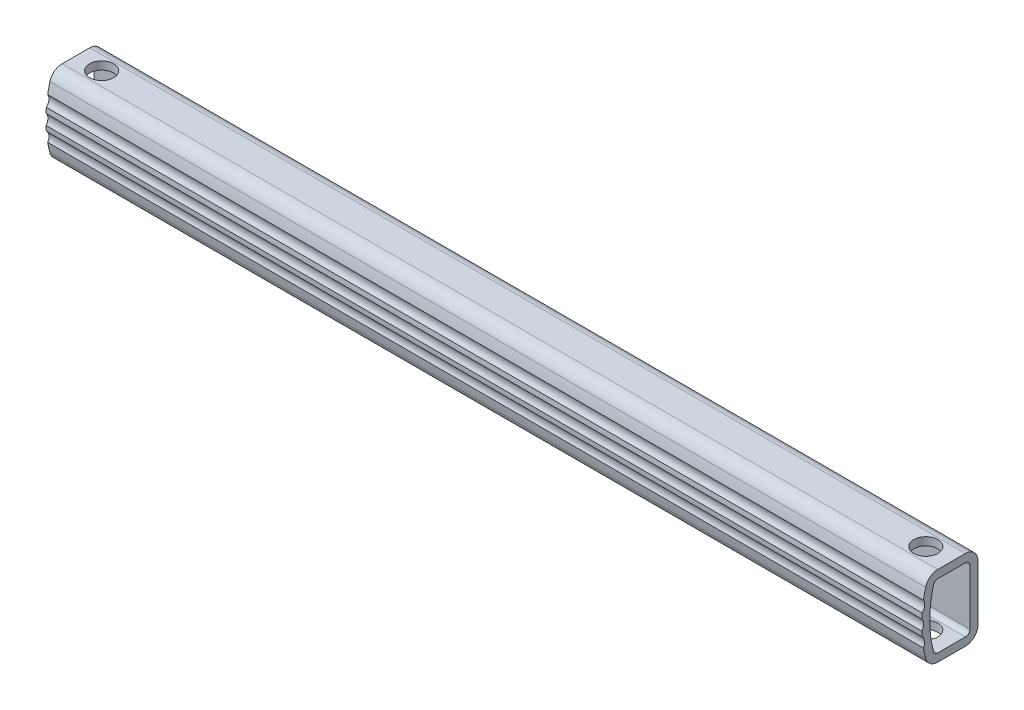
ISO-10303-21;
HEADER;
FILE_DESCRIPTION(('STEP AP214'),'2;1');
FILE_NAME('part.step','',(''),(''),'','','');
FILE_SCHEMA(('AUTOMOTIVE_DESIGN { 1 0 10303 214 1 1 1 1 }'));
ENDSEC;
DATA;
#1=APPLICATION_CONTEXT('core data for automotive mechanical design processes');
#2=APPLICATION_PROTOCOL_DEFINITION('international standard','automotive_design',2000,#1);
#3=PRODUCT_CONTEXT('',#1,'mechanical');
#4=PRODUCT('Part','Part','',(#3));
#5=PRODUCT_RELATED_PRODUCT_CATEGORY('part','',(#4));
#6=PRODUCT_DEFINITION_FORMATION('','',#4);
#7=PRODUCT_DEFINITION_CONTEXT('part definition',#1,'design');
#8=PRODUCT_DEFINITION('design','',#6,#7);
#9=PRODUCT_DEFINITION_SHAPE('','',#8);
#10=(LENGTH_UNIT() NAMED_UNIT(*) SI_UNIT(.MILLI.,.METRE.));
#11=(NAMED_UNIT(*) PLANE_ANGLE_UNIT() SI_UNIT($,.RADIAN.));
#12=(NAMED_UNIT(*) SI_UNIT($,.STERADIAN.) SOLID_ANGLE_UNIT());
#13=UNCERTAINTY_MEASURE_WITH_UNIT(LENGTH_MEASURE(1.E-05),#10,'distance_accuracy_value','');
#14=(GEOMETRIC_REPRESENTATION_CONTEXT(3) GLOBAL_UNCERTAINTY_ASSIGNED_CONTEXT((#13)) GLOBAL_UNIT_ASSIGNED_CONTEXT((#10,
#11,#12)) REPRESENTATION_CONTEXT('',''));
#15=CARTESIAN_POINT('',(0.,0.,0.));
#16=DIRECTION('',(0.,0.,1.));
#17=DIRECTION('',(1.,0.,0.));
#18=AXIS2_PLACEMENT_3D('',#15,#16,#17);
#19=CARTESIAN_POINT('',(54.5,0.,-11.270134066358));
#20=DIRECTION('',(-1.,0.,0.));
#21=DIRECTION('',(0.,0.,1.));
#22=AXIS2_PLACEMENT_3D('',#19,#20,#21);
#23=PLANE('',#22);
#24=CARTESIAN_POINT('',(54.5,0.,-11.270134066358));
#25=DIRECTION('',(1.,0.,0.));
#26=DIRECTION('',(0.,0.,1.));
#27=AXIS2_PLACEMENT_3D('',#24,#25,#26);
#28=CIRCLE('',#27,15.);
#29=CARTESIAN_POINT('',(54.5,3.83260030517907,3.23197525955527));
#30=VERTEX_POINT('',#29);
#31=CARTESIAN_POINT('',(54.5,2.5705835723426,3.50796121339987));
#32=VERTEX_POINT('',#31);
#33=EDGE_CURVE('E249',#30,#32,#28,.T.);
#34=ORIENTED_EDGE('',*,*,#33,.T.);
#35=CARTESIAN_POINT('',(54.5,2.02902279715001,4.34862281402928));
#36=DIRECTION('',(-1.,0.,0.));
#37=DIRECTION('',(0.,0.,-1.));
#38=AXIS2_PLACEMENT_3D('',#35,#36,#37);
#39=CIRCLE('',#38,1.);
#40=CARTESIAN_POINT('',(54.5,1.29064323211042,3.67423745095269));
#41=VERTEX_POINT('',#40);
#42=EDGE_CURVE('E252',#32,#41,#39,.T.);
#43=ORIENTED_EDGE('',*,*,#42,.T.);
#44=CARTESIAN_POINT('',(54.5,0.,-11.270134066358));
#45=DIRECTION('',(1.,0.,0.));
#46=DIRECTION('',(0.,0.,1.));
#47=AXIS2_PLACEMENT_3D('',#44,#45,#46);
#48=CIRCLE('',#47,15.);
#49=CARTESIAN_POINT('',(54.5,0.645347786416052,3.71597704475309));
#50=VERTEX_POINT('',#49);
#51=EDGE_CURVE('E255',#41,#50,#48,.T.);
#52=ORIENTED_EDGE('',*,*,#51,.T.);
#53=CARTESIAN_POINT('',(54.5,0.,4.47986593364197));
#54=DIRECTION('',(-1.,0.,0.));
#55=DIRECTION('',(0.,0.,1.));
#56=AXIS2_PLACEMENT_3D('',#53,#54,#55);
#57=CIRCLE('',#56,1.);
#58=CARTESIAN_POINT('',(54.5,-0.645347786416046,3.71597704475309));
#59=VERTEX_POINT('',#58);
#60=EDGE_CURVE('E257',#50,#59,#57,.T.);
#61=ORIENTED_EDGE('',*,*,#60,.T.);
#62=CARTESIAN_POINT('',(54.5,0.,-11.270134066358));
#63=DIRECTION('',(1.,0.,0.));
#64=DIRECTION('',(0.,0.,-1.));
#65=AXIS2_PLACEMENT_3D('',#62,#63,#64);
#66=CIRCLE('',#65,15.);
#67=CARTESIAN_POINT('',(54.5,-1.29064323211042,3.67423745095269));
#68=VERTEX_POINT('',#67);
#69=EDGE_CURVE('E259',#59,#68,#66,.T.);
#70=ORIENTED_EDGE('',*,*,#69,.T.);
#71=CARTESIAN_POINT('',(54.5,-2.02902279715001,4.34862281402928));
#72=DIRECTION('',(-1.,0.,0.));
#73=DIRECTION('',(0.,0.,1.));
#74=AXIS2_PLACEMENT_3D('',#71,#72,#73);
#75=CIRCLE('',#74,1.);
#76=CARTESIAN_POINT('',(54.5,-2.57058357234259,3.50796121339987));
#77=VERTEX_POINT('',#76);
#78=EDGE_CURVE('E261',#68,#77,#75,.T.);
#79=ORIENTED_EDGE('',*,*,#78,.T.);
#80=CARTESIAN_POINT('',(54.5,0.,-11.270134066358));
#81=DIRECTION('',(1.,0.,0.));
#82=DIRECTION('',(0.,0.,-1.));
#83=AXIS2_PLACEMENT_3D('',#80,#81,#82);
#84=CIRCLE('',#83,15.);
#85=CARTESIAN_POINT('',(54.5,-3.83260030517907,3.23197525955527));
#86=VERTEX_POINT('',#85);
#87=EDGE_CURVE('E263',#77,#86,#84,.T.);
#88=ORIENTED_EDGE('',*,*,#87,.T.);
#89=CARTESIAN_POINT('',(54.5,-3.43195408950617,1.71597704475308));
#90=DIRECTION('',(1.,0.,0.));
#91=DIRECTION('',(0.,0.,-1.));
#92=AXIS2_PLACEMENT_3D('',#89,#90,#91);
#93=CIRCLE('',#92,1.56804591049383);
#94=CARTESIAN_POINT('',(54.5,-5.,1.71597704475308));
#95=VERTEX_POINT('',#94);
#96=EDGE_CURVE('E265',#86,#95,#93,.T.);
#97=ORIENTED_EDGE('',*,*,#96,.T.);
#98=DIRECTION('',(0.,0.,-1.));
#99=VECTOR('',#98,1.);
#100=CARTESIAN_POINT('',(54.5,-5.,1.71597704475308));
#101=LINE('',#100,#99);
#102=CARTESIAN_POINT('',(54.5,-5.,-1.71597704475308));
#103=VERTEX_POINT('',#102);
#104=EDGE_CURVE('E267',#95,#103,#101,.T.);
#105=ORIENTED_EDGE('',*,*,#104,.T.);
#106=CARTESIAN_POINT('',(54.5,-3.43195408950617,-1.71597704475308));
#107=DIRECTION('',(1.,0.,0.));
#108=DIRECTION('',(0.,0.,-1.));
#109=AXIS2_PLACEMENT_3D('',#106,#107,#108);
#110=CIRCLE('',#109,1.56804591049383);
#111=CARTESIAN_POINT('',(54.5,-3.43195408950617,-3.28402295524692));
#112=VERTEX_POINT('',#111);
#113=EDGE_CURVE('E269',#103,#112,#110,.T.);
#114=ORIENTED_EDGE('',*,*,#113,.T.);
#115=DIRECTION('',(0.,1.,0.));
#116=VECTOR('',#115,1.);
#117=CARTESIAN_POINT('',(54.5,3.43195408950617,-3.28402295524692));
#118=LINE('',#117,#116);
#119=CARTESIAN_POINT('',(54.5,3.43195408950617,-3.28402295524692));
#120=VERTEX_POINT('',#119);
#121=EDGE_CURVE('E271',#112,#120,#118,.T.);
#122=ORIENTED_EDGE('',*,*,#121,.T.);
#123=CARTESIAN_POINT('',(54.5,3.43195408950617,-1.71597704475308));
#124=DIRECTION('',(1.,0.,0.));
#125=DIRECTION('',(0.,0.,1.));
#126=AXIS2_PLACEMENT_3D('',#123,#124,#125);
#127=CIRCLE('',#126,1.56804591049383);
#128=CARTESIAN_POINT('',(54.5,5.,-1.71597704475308));
#129=VERTEX_POINT('',#128);
#130=EDGE_CURVE('E273',#120,#129,#127,.T.);
#131=ORIENTED_EDGE('',*,*,#130,.T.);
#132=DIRECTION('',(0.,0.,1.));
#133=VECTOR('',#132,1.);
#134=CARTESIAN_POINT('',(54.5,5.,1.71597704475308));
#135=LINE('',#134,#133);
#136=CARTESIAN_POINT('',(54.5,5.,1.71597704475308));
#137=VERTEX_POINT('',#136);
#138=EDGE_CURVE('E275',#129,#137,#135,.T.);
#139=ORIENTED_EDGE('',*,*,#138,.T.);
#140=CARTESIAN_POINT('',(54.5,3.43195408950617,1.71597704475308));
#141=DIRECTION('',(1.,0.,0.));
#142=DIRECTION('',(0.,0.,1.));
#143=AXIS2_PLACEMENT_3D('',#140,#141,#142);
#144=CIRCLE('',#143,1.56804591049383);
#145=EDGE_CURVE('E277',#137,#30,#144,.T.);
#146=ORIENTED_EDGE('',*,*,#145,.T.);
#147=EDGE_LOOP('',(#34,#43,#52,#61,#70,#79,#88,#97,#105,#114,#122,#131,#139,#146));
#148=FACE_BOUND('',#147,.T.);
#149=CARTESIAN_POINT('',(54.5,3.43195408950617,1.71597704475308));
#150=DIRECTION('',(1.,0.,0.));
#151=DIRECTION('',(0.,0.,1.));
#152=AXIS2_PLACEMENT_3D('',#149,#150,#151);
#153=CIRCLE('',#152,0.568045910493831);
#154=CARTESIAN_POINT('',(54.5,4.,1.71597704475308));
#155=VERTEX_POINT('',#154);
#156=CARTESIAN_POINT('',(54.5,3.57709361816713,2.26516797116105));
#157=VERTEX_POINT('',#156);
#158=EDGE_CURVE('E182',#155,#157,#153,.T.);
#159=ORIENTED_EDGE('',*,*,#158,.F.);
#160=DIRECTION('',(0.,0.,1.));
#161=VECTOR('',#160,1.);
#162=CARTESIAN_POINT('',(54.5,4.,1.71597704475308));
#163=LINE('',#162,#161);
#164=CARTESIAN_POINT('',(54.5,4.,-1.71597704475309));
#165=VERTEX_POINT('',#164);
#166=EDGE_CURVE('E216',#165,#155,#163,.T.);
#167=ORIENTED_EDGE('',*,*,#166,.F.);
#168=CARTESIAN_POINT('',(54.5,3.43195408950617,-1.71597704475308));
#169=DIRECTION('',(1.,0.,0.));
#170=DIRECTION('',(0.,0.,1.));
#171=AXIS2_PLACEMENT_3D('',#168,#169,#170);
#172=CIRCLE('',#171,0.568045910493831);
#173=CARTESIAN_POINT('',(54.5,3.43195408950617,-2.28402295524691));
#174=VERTEX_POINT('',#173);
#175=EDGE_CURVE('E214',#174,#165,#172,.T.);
#176=ORIENTED_EDGE('',*,*,#175,.F.);
#177=DIRECTION('',(0.,1.,0.));
#178=VECTOR('',#177,1.);
#179=CARTESIAN_POINT('',(54.5,3.43195408950617,-2.28402295524691));
#180=LINE('',#179,#178);
#181=CARTESIAN_POINT('',(54.5,-3.43195408950617,-2.28402295524692));
#182=VERTEX_POINT('',#181);
#183=EDGE_CURVE('E212',#182,#174,#180,.T.);
#184=ORIENTED_EDGE('',*,*,#183,.F.);
#185=CARTESIAN_POINT('',(54.5,-3.43195408950617,-1.71597704475308));
#186=DIRECTION('',(1.,0.,0.));
#187=DIRECTION('',(0.,0.,-1.));
#188=AXIS2_PLACEMENT_3D('',#185,#186,#187);
#189=CIRCLE('',#188,0.568045910493831);
#190=CARTESIAN_POINT('',(54.5,-4.,-1.71597704475309));
#191=VERTEX_POINT('',#190);
#192=EDGE_CURVE('E210',#191,#182,#189,.T.);
#193=ORIENTED_EDGE('',*,*,#192,.F.);
#194=DIRECTION('',(0.,0.,-1.));
#195=VECTOR('',#194,1.);
#196=CARTESIAN_POINT('',(54.5,-4.,1.71597704475309));
#197=LINE('',#196,#195);
#198=CARTESIAN_POINT('',(54.5,-4.,1.71597704475309));
#199=VERTEX_POINT('',#198);
#200=EDGE_CURVE('E205',#199,#191,#197,.T.);
#201=ORIENTED_EDGE('',*,*,#200,.F.);
#202=CARTESIAN_POINT('',(54.5,-3.43195408950617,1.71597704475308));
#203=DIRECTION('',(1.,0.,0.));
#204=DIRECTION('',(0.,0.,-1.));
#205=AXIS2_PLACEMENT_3D('',#202,#203,#204);
#206=CIRCLE('',#205,0.568045910493831);
#207=CARTESIAN_POINT('',(54.5,-3.57709361816713,2.26516797116105));
#208=VERTEX_POINT('',#207);
#209=EDGE_CURVE('E203',#208,#199,#206,.T.);
#210=ORIENTED_EDGE('',*,*,#209,.F.);
#211=CARTESIAN_POINT('',(54.5,0.,-11.270134066358));
#212=DIRECTION('',(1.,0.,0.));
#213=DIRECTION('',(0.,0.,1.));
#214=AXIS2_PLACEMENT_3D('',#211,#212,#213);
#215=CIRCLE('',#214,14.);
#216=EDGE_CURVE('E190',#157,#208,#215,.T.);
#217=ORIENTED_EDGE('',*,*,#216,.F.);
#218=EDGE_LOOP('',(#159,#167,#176,#184,#193,#201,#210,#217));
#219=FACE_BOUND('',#218,.T.);
#220=ADVANCED_FACE('F31',(#148,#219),#23,.F.);
#221=CARTESIAN_POINT('',(-54.5,0.,-11.270134066358));
#222=DIRECTION('',(-1.,0.,0.));
#223=DIRECTION('',(0.,0.,1.));
#224=AXIS2_PLACEMENT_3D('',#221,#222,#223);
#225=PLANE('',#224);
#226=CARTESIAN_POINT('',(-54.5,0.,-11.270134066358));
#227=DIRECTION('',(1.,0.,0.));
#228=DIRECTION('',(0.,0.,1.));
#229=AXIS2_PLACEMENT_3D('',#226,#227,#228);
#230=CIRCLE('',#229,15.);
#231=CARTESIAN_POINT('',(-54.5,3.83260030517907,3.23197525955527));
#232=VERTEX_POINT('',#231);
#233=CARTESIAN_POINT('',(-54.5,2.5705835723426,3.50796121339987));
#234=VERTEX_POINT('',#233);
#235=EDGE_CURVE('E198',#232,#234,#230,.T.);
#236=ORIENTED_EDGE('',*,*,#235,.F.);
#237=CARTESIAN_POINT('',(-54.5,3.43195408950617,1.71597704475308));
#238=DIRECTION('',(1.,0.,0.));
#239=DIRECTION('',(0.,0.,1.));
#240=AXIS2_PLACEMENT_3D('',#237,#238,#239);
#241=CIRCLE('',#240,1.56804591049383);
#242=CARTESIAN_POINT('',(-54.5,5.,1.71597704475308));
#243=VERTEX_POINT('',#242);
#244=EDGE_CURVE('E253',#243,#232,#241,.T.);
#245=ORIENTED_EDGE('',*,*,#244,.F.);
#246=DIRECTION('',(0.,0.,1.));
#247=VECTOR('',#246,1.);
#248=CARTESIAN_POINT('',(-54.5,5.,1.71597704475308));
#249=LINE('',#248,#247);
#250=CARTESIAN_POINT('',(-54.5,5.,-1.71597704475308));
#251=VERTEX_POINT('',#250);
#252=EDGE_CURVE('E304',#251,#243,#249,.T.);
#253=ORIENTED_EDGE('',*,*,#252,.F.);
#254=CARTESIAN_POINT('',(-54.5,3.43195408950617,-1.71597704475308));
#255=DIRECTION('',(1.,0.,0.));
#256=DIRECTION('',(0.,0.,1.));
#257=AXIS2_PLACEMENT_3D('',#254,#255,#256);
#258=CIRCLE('',#257,1.56804591049383);
#259=CARTESIAN_POINT('',(-54.5,3.43195408950617,-3.28402295524692));
#260=VERTEX_POINT('',#259);
#261=EDGE_CURVE('E302',#260,#251,#258,.T.);
#262=ORIENTED_EDGE('',*,*,#261,.F.);
#263=DIRECTION('',(0.,1.,0.));
#264=VECTOR('',#263,1.);
#265=CARTESIAN_POINT('',(-54.5,3.43195408950617,-3.28402295524692));
#266=LINE('',#265,#264);
#267=CARTESIAN_POINT('',(-54.5,-3.43195408950617,-3.28402295524692));
#268=VERTEX_POINT('',#267);
#269=EDGE_CURVE('E300',#268,#260,#266,.T.);
#270=ORIENTED_EDGE('',*,*,#269,.F.);
#271=CARTESIAN_POINT('',(-54.5,-3.43195408950617,-1.71597704475308));
#272=DIRECTION('',(1.,0.,0.));
#273=DIRECTION('',(0.,0.,-1.));
#274=AXIS2_PLACEMENT_3D('',#271,#272,#273);
#275=CIRCLE('',#274,1.56804591049383);
#276=CARTESIAN_POINT('',(-54.5,-5.,-1.71597704475308));
#277=VERTEX_POINT('',#276);
#278=EDGE_CURVE('E298',#277,#268,#275,.T.);
#279=ORIENTED_EDGE('',*,*,#278,.F.);
#280=DIRECTION('',(0.,0.,-1.));
#281=VECTOR('',#280,1.);
#282=CARTESIAN_POINT('',(-54.5,-5.,1.71597704475308));
#283=LINE('',#282,#281);
#284=CARTESIAN_POINT('',(-54.5,-5.,1.71597704475308));
#285=VERTEX_POINT('',#284);
#286=EDGE_CURVE('E296',#285,#277,#283,.T.);
#287=ORIENTED_EDGE('',*,*,#286,.F.);
#288=CARTESIAN_POINT('',(-54.5,-3.43195408950617,1.71597704475308));
#289=DIRECTION('',(1.,0.,0.));
#290=DIRECTION('',(0.,0.,-1.));
#291=AXIS2_PLACEMENT_3D('',#288,#289,#290);
#292=CIRCLE('',#291,1.56804591049383);
#293=CARTESIAN_POINT('',(-54.5,-3.83260030517907,3.23197525955527));
#294=VERTEX_POINT('',#293);
#295=EDGE_CURVE('E294',#294,#285,#292,.T.);
#296=ORIENTED_EDGE('',*,*,#295,.F.);
#297=CARTESIAN_POINT('',(-54.5,0.,-11.270134066358));
#298=DIRECTION('',(1.,0.,0.));
#299=DIRECTION('',(0.,0.,-1.));
#300=AXIS2_PLACEMENT_3D('',#297,#298,#299);
#301=CIRCLE('',#300,15.);
#302=CARTESIAN_POINT('',(-54.5,-2.57058357234259,3.50796121339987));
#303=VERTEX_POINT('',#302);
#304=EDGE_CURVE('E292',#303,#294,#301,.T.);
#305=ORIENTED_EDGE('',*,*,#304,.F.);
#306=CARTESIAN_POINT('',(-54.5,-2.02902279715001,4.34862281402928));
#307=DIRECTION('',(-1.,0.,0.));
#308=DIRECTION('',(0.,0.,1.));
#309=AXIS2_PLACEMENT_3D('',#306,#307,#308);
#310=CIRCLE('',#309,1.);
#311=CARTESIAN_POINT('',(-54.5,-1.29064323211042,3.67423745095269));
#312=VERTEX_POINT('',#311);
#313=EDGE_CURVE('E290',#312,#303,#310,.T.);
#314=ORIENTED_EDGE('',*,*,#313,.F.);
#315=CARTESIAN_POINT('',(-54.5,0.,-11.270134066358));
#316=DIRECTION('',(1.,0.,0.));
#317=DIRECTION('',(0.,0.,-1.));
#318=AXIS2_PLACEMENT_3D('',#315,#316,#317);
#319=CIRCLE('',#318,15.);
#320=CARTESIAN_POINT('',(-54.5,-0.645347786416046,3.71597704475309));
#321=VERTEX_POINT('',#320);
#322=EDGE_CURVE('E288',#321,#312,#319,.T.);
#323=ORIENTED_EDGE('',*,*,#322,.F.);
#324=CARTESIAN_POINT('',(-54.5,0.,4.47986593364197));
#325=DIRECTION('',(-1.,0.,0.));
#326=DIRECTION('',(0.,0.,1.));
#327=AXIS2_PLACEMENT_3D('',#324,#325,#326);
#328=CIRCLE('',#327,1.);
#329=CARTESIAN_POINT('',(-54.5,0.645347786416052,3.71597704475309));
#330=VERTEX_POINT('',#329);
#331=EDGE_CURVE('E286',#330,#321,#328,.T.);
#332=ORIENTED_EDGE('',*,*,#331,.F.);
#333=CARTESIAN_POINT('',(-54.5,0.,-11.270134066358));
#334=DIRECTION('',(1.,0.,0.));
#335=DIRECTION('',(0.,0.,1.));
#336=AXIS2_PLACEMENT_3D('',#333,#334,#335);
#337=CIRCLE('',#336,15.);
#338=CARTESIAN_POINT('',(-54.5,1.29064323211042,3.67423745095269));
#339=VERTEX_POINT('',#338);
#340=EDGE_CURVE('E284',#339,#330,#337,.T.);
#341=ORIENTED_EDGE('',*,*,#340,.F.);
#342=CARTESIAN_POINT('',(-54.5,2.02902279715001,4.34862281402928));
#343=DIRECTION('',(-1.,0.,0.));
#344=DIRECTION('',(0.,0.,-1.));
#345=AXIS2_PLACEMENT_3D('',#342,#343,#344);
#346=CIRCLE('',#345,1.);
#347=EDGE_CURVE('E282',#234,#339,#346,.T.);
#348=ORIENTED_EDGE('',*,*,#347,.F.);
#349=EDGE_LOOP('',(#236,#245,#253,#262,#270,#279,#287,#296,#305,#314,#323,#332,#341,#348));
#350=FACE_BOUND('',#349,.T.);
#351=DIRECTION('',(0.,0.,1.));
#352=VECTOR('',#351,1.);
#353=CARTESIAN_POINT('',(-54.5,4.,1.71597704475308));
#354=LINE('',#353,#352);
#355=CARTESIAN_POINT('',(-54.5,4.,-1.71597704475308));
#356=VERTEX_POINT('',#355);
#357=CARTESIAN_POINT('',(-54.5,4.,1.71597704475309));
#358=VERTEX_POINT('',#357);
#359=EDGE_CURVE('E191',#356,#358,#354,.T.);
#360=ORIENTED_EDGE('',*,*,#359,.T.);
#361=CARTESIAN_POINT('',(-54.5,3.43195408950617,1.71597704475308));
#362=DIRECTION('',(1.,0.,0.));
#363=DIRECTION('',(0.,0.,1.));
#364=AXIS2_PLACEMENT_3D('',#361,#362,#363);
#365=CIRCLE('',#364,0.568045910493831);
#366=CARTESIAN_POINT('',(-54.5,3.57709361816713,2.26516797116105));
#367=VERTEX_POINT('',#366);
#368=EDGE_CURVE('E56',#358,#367,#365,.T.);
#369=ORIENTED_EDGE('',*,*,#368,.T.);
#370=CARTESIAN_POINT('',(-54.5,0.,-11.270134066358));
#371=DIRECTION('',(1.,0.,0.));
#372=DIRECTION('',(0.,0.,1.));
#373=AXIS2_PLACEMENT_3D('',#370,#371,#372);
#374=CIRCLE('',#373,14.);
#375=CARTESIAN_POINT('',(-54.5,-3.57709361816713,2.26516797116105));
#376=VERTEX_POINT('',#375);
#377=EDGE_CURVE('E197',#367,#376,#374,.T.);
#378=ORIENTED_EDGE('',*,*,#377,.T.);
#379=CARTESIAN_POINT('',(-54.5,-3.43195408950617,1.71597704475308));
#380=DIRECTION('',(1.,0.,0.));
#381=DIRECTION('',(0.,0.,-1.));
#382=AXIS2_PLACEMENT_3D('',#379,#380,#381);
#383=CIRCLE('',#382,0.568045910493831);
#384=CARTESIAN_POINT('',(-54.5,-4.,1.71597704475309));
#385=VERTEX_POINT('',#384);
#386=EDGE_CURVE('E221',#376,#385,#383,.T.);
#387=ORIENTED_EDGE('',*,*,#386,.T.);
#388=DIRECTION('',(0.,0.,-1.));
#389=VECTOR('',#388,1.);
#390=CARTESIAN_POINT('',(-54.5,-4.,1.71597704475309));
#391=LINE('',#390,#389);
#392=CARTESIAN_POINT('',(-54.5,-4.,-1.71597704475309));
#393=VERTEX_POINT('',#392);
#394=EDGE_CURVE('E224',#385,#393,#391,.T.);
#395=ORIENTED_EDGE('',*,*,#394,.T.);
#396=CARTESIAN_POINT('',(-54.5,-3.43195408950617,-1.71597704475308));
#397=DIRECTION('',(1.,0.,0.));
#398=DIRECTION('',(0.,0.,-1.));
#399=AXIS2_PLACEMENT_3D('',#396,#397,#398);
#400=CIRCLE('',#399,0.568045910493831);
#401=CARTESIAN_POINT('',(-54.5,-3.43195408950617,-2.28402295524692));
#402=VERTEX_POINT('',#401);
#403=EDGE_CURVE('E227',#393,#402,#400,.T.);
#404=ORIENTED_EDGE('',*,*,#403,.T.);
#405=DIRECTION('',(0.,1.,0.));
#406=VECTOR('',#405,1.);
#407=CARTESIAN_POINT('',(-54.5,3.43195408950617,-2.28402295524691));
#408=LINE('',#407,#406);
#409=CARTESIAN_POINT('',(-54.5,3.43195408950617,-2.28402295524691));
#410=VERTEX_POINT('',#409);
#411=EDGE_CURVE('E230',#402,#410,#408,.T.);
#412=ORIENTED_EDGE('',*,*,#411,.T.);
#413=CARTESIAN_POINT('',(-54.5,3.43195408950617,-1.71597704475308));
#414=DIRECTION('',(1.,0.,0.));
#415=DIRECTION('',(0.,0.,1.));
#416=AXIS2_PLACEMENT_3D('',#413,#414,#415);
#417=CIRCLE('',#416,0.568045910493831);
#418=EDGE_CURVE('E233',#410,#356,#417,.T.);
#419=ORIENTED_EDGE('',*,*,#418,.T.);
#420=EDGE_LOOP('',(#360,#369,#378,#387,#395,#404,#412,#419));
#421=FACE_BOUND('',#420,.T.);
#422=ADVANCED_FACE('F388',(#350,#421),#225,.T.);
#423=CARTESIAN_POINT('',(54.5,0.,-11.270134066358));
#424=DIRECTION('',(-1.,0.,0.));
#425=DIRECTION('',(0.,0.,1.));
#426=AXIS2_PLACEMENT_3D('',#423,#424,#425);
#427=CYLINDRICAL_SURFACE('',#426,15.);
#428=ORIENTED_EDGE('',*,*,#235,.T.);
#429=DIRECTION('',(-1.,0.,0.));
#430=VECTOR('',#429,1.);
#431=CARTESIAN_POINT('',(54.5,2.5705835723426,3.50796121339987));
#432=LINE('',#431,#430);
#433=EDGE_CURVE('E11',#32,#234,#432,.T.);
#434=ORIENTED_EDGE('',*,*,#433,.F.);
#435=ORIENTED_EDGE('',*,*,#33,.F.);
#436=DIRECTION('',(-1.,0.,0.));
#437=VECTOR('',#436,1.);
#438=CARTESIAN_POINT('',(54.5,3.83260030517907,3.23197525955527));
#439=LINE('',#438,#437);
#440=EDGE_CURVE('E279',#30,#232,#439,.T.);
#441=ORIENTED_EDGE('',*,*,#440,.T.);
#442=EDGE_LOOP('',(#428,#434,#435,#441));
#443=FACE_BOUND('',#442,.T.);
#444=ADVANCED_FACE('F33',(#443),#427,.T.);
#445=CARTESIAN_POINT('',(54.5,2.02902279715001,4.34862281402928));
#446=DIRECTION('',(-1.,0.,0.));
#447=DIRECTION('',(0.,0.,1.));
#448=AXIS2_PLACEMENT_3D('',#445,#446,#447);
#449=CYLINDRICAL_SURFACE('',#448,1.);
#450=ORIENTED_EDGE('',*,*,#347,.T.);
#451=DIRECTION('',(-1.,0.,0.));
#452=VECTOR('',#451,1.);
#453=CARTESIAN_POINT('',(54.5,1.29064323211042,3.67423745095269));
#454=LINE('',#453,#452);
#455=EDGE_CURVE('E40',#41,#339,#454,.T.);
#456=ORIENTED_EDGE('',*,*,#455,.F.);
#457=ORIENTED_EDGE('',*,*,#42,.F.);
#458=ORIENTED_EDGE('',*,*,#433,.T.);
#459=EDGE_LOOP('',(#450,#456,#457,#458));
#460=FACE_BOUND('',#459,.T.);
#461=ADVANCED_FACE('F443',(#460),#449,.F.);
#462=CARTESIAN_POINT('',(54.5,0.,-11.270134066358));
#463=DIRECTION('',(-1.,0.,0.));
#464=DIRECTION('',(0.,0.,1.));
#465=AXIS2_PLACEMENT_3D('',#462,#463,#464);
#466=CYLINDRICAL_SURFACE('',#465,15.);
#467=ORIENTED_EDGE('',*,*,#340,.T.);
#468=DIRECTION('',(-1.,0.,0.));
#469=VECTOR('',#468,1.);
#470=CARTESIAN_POINT('',(54.5,0.645347786416052,3.71597704475309));
#471=LINE('',#470,#469);
#472=EDGE_CURVE('E339',#50,#330,#471,.T.);
#473=ORIENTED_EDGE('',*,*,#472,.F.);
#474=ORIENTED_EDGE('',*,*,#51,.F.);
#475=ORIENTED_EDGE('',*,*,#455,.T.);
#476=EDGE_LOOP('',(#467,#473,#474,#475));
#477=FACE_BOUND('',#476,.T.);
#478=ADVANCED_FACE('F441',(#477),#466,.T.);
#479=CARTESIAN_POINT('',(54.5,0.,4.47986593364197));
#480=DIRECTION('',(-1.,0.,0.));
#481=DIRECTION('',(0.,0.,1.));
#482=AXIS2_PLACEMENT_3D('',#479,#480,#481);
#483=CYLINDRICAL_SURFACE('',#482,1.);
#484=ORIENTED_EDGE('',*,*,#331,.T.);
#485=DIRECTION('',(-1.,0.,0.));
#486=VECTOR('',#485,1.);
#487=CARTESIAN_POINT('',(54.5,-0.645347786416046,3.71597704475309));
#488=LINE('',#487,#486);
#489=EDGE_CURVE('E336',#59,#321,#488,.T.);
#490=ORIENTED_EDGE('',*,*,#489,.F.);
#491=ORIENTED_EDGE('',*,*,#60,.F.);
#492=ORIENTED_EDGE('',*,*,#472,.T.);
#493=EDGE_LOOP('',(#484,#490,#491,#492));
#494=FACE_BOUND('',#493,.T.);
#495=ADVANCED_FACE('F437',(#494),#483,.F.);
#496=CARTESIAN_POINT('',(54.5,0.,-11.270134066358));
#497=DIRECTION('',(-1.,0.,0.));
#498=DIRECTION('',(0.,0.,1.));
#499=AXIS2_PLACEMENT_3D('',#496,#497,#498);
#500=CYLINDRICAL_SURFACE('',#499,15.);
#501=ORIENTED_EDGE('',*,*,#322,.T.);
#502=DIRECTION('',(-1.,0.,0.));
#503=VECTOR('',#502,1.);
#504=CARTESIAN_POINT('',(54.5,-1.29064323211042,3.67423745095269));
#505=LINE('',#504,#503);
#506=EDGE_CURVE('E333',#68,#312,#505,.T.);
#507=ORIENTED_EDGE('',*,*,#506,.F.);
#508=ORIENTED_EDGE('',*,*,#69,.F.);
#509=ORIENTED_EDGE('',*,*,#489,.T.);
#510=EDGE_LOOP('',(#501,#507,#508,#509));
#511=FACE_BOUND('',#510,.T.);
#512=ADVANCED_FACE('F432',(#511),#500,.T.);
#513=CARTESIAN_POINT('',(54.5,-2.02902279715001,4.34862281402928));
#514=DIRECTION('',(-1.,0.,0.));
#515=DIRECTION('',(0.,0.,1.));
#516=AXIS2_PLACEMENT_3D('',#513,#514,#515);
#517=CYLINDRICAL_SURFACE('',#516,1.);
#518=ORIENTED_EDGE('',*,*,#313,.T.);
#519=DIRECTION('',(-1.,0.,0.));
#520=VECTOR('',#519,1.);
#521=CARTESIAN_POINT('',(54.5,-2.57058357234259,3.50796121339987));
#522=LINE('',#521,#520);
#523=EDGE_CURVE('E330',#77,#303,#522,.T.);
#524=ORIENTED_EDGE('',*,*,#523,.F.);
#525=ORIENTED_EDGE('',*,*,#78,.F.);
#526=ORIENTED_EDGE('',*,*,#506,.T.);
#527=EDGE_LOOP('',(#518,#524,#525,#526));
#528=FACE_BOUND('',#527,.T.);
#529=ADVANCED_FACE('F427',(#528),#517,.F.);
#530=CARTESIAN_POINT('',(54.5,0.,-11.270134066358));
#531=DIRECTION('',(-1.,0.,0.));
#532=DIRECTION('',(0.,0.,1.));
#533=AXIS2_PLACEMENT_3D('',#530,#531,#532);
#534=CYLINDRICAL_SURFACE('',#533,15.);
#535=ORIENTED_EDGE('',*,*,#304,.T.);
#536=DIRECTION('',(-1.,0.,0.));
#537=VECTOR('',#536,1.);
#538=CARTESIAN_POINT('',(54.5,-3.83260030517907,3.23197525955527));
#539=LINE('',#538,#537);
#540=EDGE_CURVE('E327',#86,#294,#539,.T.);
#541=ORIENTED_EDGE('',*,*,#540,.F.);
#542=ORIENTED_EDGE('',*,*,#87,.F.);
#543=ORIENTED_EDGE('',*,*,#523,.T.);
#544=EDGE_LOOP('',(#535,#541,#542,#543));
#545=FACE_BOUND('',#544,.T.);
#546=ADVANCED_FACE('F423',(#545),#534,.T.);
#547=CARTESIAN_POINT('',(54.5,-3.43195408950617,1.71597704475308));
#548=DIRECTION('',(-1.,0.,0.));
#549=DIRECTION('',(0.,0.,1.));
#550=AXIS2_PLACEMENT_3D('',#547,#548,#549);
#551=CYLINDRICAL_SURFACE('',#550,1.56804591049383);
#552=ORIENTED_EDGE('',*,*,#295,.T.);
#553=DIRECTION('',(-1.,0.,0.));
#554=VECTOR('',#553,1.);
#555=CARTESIAN_POINT('',(54.5,-5.,1.71597704475308));
#556=LINE('',#555,#554);
#557=EDGE_CURVE('E324',#95,#285,#556,.T.);
#558=ORIENTED_EDGE('',*,*,#557,.F.);
#559=ORIENTED_EDGE('',*,*,#96,.F.);
#560=ORIENTED_EDGE('',*,*,#540,.T.);
#561=EDGE_LOOP('',(#552,#558,#559,#560));
#562=FACE_BOUND('',#561,.T.);
#563=ADVANCED_FACE('F418',(#562),#551,.T.);
#564=CARTESIAN_POINT('',(54.5,-5.,1.71597704475308));
#565=DIRECTION('',(0.,1.,0.));
#566=DIRECTION('',(0.,0.,1.));
#567=AXIS2_PLACEMENT_3D('',#564,#565,#566);
#568=PLANE('',#567);
#569=CARTESIAN_POINT('',(51.285,-5.,0.));
#570=DIRECTION('',(0.,1.,0.));
#571=DIRECTION('',(0.,0.,-1.));
#572=AXIS2_PLACEMENT_3D('',#569,#570,#571);
#573=CIRCLE('',#572,1.5);
#574=CARTESIAN_POINT('',(51.285,-5.,-1.50000000000002));
#575=VERTEX_POINT('',#574);
#576=EDGE_CURVE('E360',#575,#575,#573,.T.);
#577=ORIENTED_EDGE('',*,*,#576,.T.);
#578=EDGE_LOOP('',(#577));
#579=FACE_BOUND('',#578,.T.);
#580=CARTESIAN_POINT('',(-51.285,-5.,0.));
#581=DIRECTION('',(0.,1.,0.));
#582=DIRECTION('',(0.,0.,1.));
#583=AXIS2_PLACEMENT_3D('',#580,#581,#582);
#584=CIRCLE('',#583,1.5);
#585=CARTESIAN_POINT('',(-51.285,-5.,1.5));
#586=VERTEX_POINT('',#585);
#587=EDGE_CURVE('E345',#586,#586,#584,.T.);
#588=ORIENTED_EDGE('',*,*,#587,.T.);
#589=EDGE_LOOP('',(#588));
#590=FACE_BOUND('',#589,.T.);
#591=ORIENTED_EDGE('',*,*,#286,.T.);
#592=DIRECTION('',(-1.,0.,0.));
#593=VECTOR('',#592,1.);
#594=CARTESIAN_POINT('',(54.5,-5.,-1.71597704475308));
#595=LINE('',#594,#593);
#596=EDGE_CURVE('E321',#103,#277,#595,.T.);
#597=ORIENTED_EDGE('',*,*,#596,.F.);
#598=ORIENTED_EDGE('',*,*,#104,.F.);
#599=ORIENTED_EDGE('',*,*,#557,.T.);
#600=EDGE_LOOP('',(#591,#597,#598,#599));
#601=FACE_BOUND('',#600,.T.);
#602=ADVANCED_FACE('F412',(#579,#590,#601),#568,.F.);
#603=CARTESIAN_POINT('',(54.5,-3.43195408950617,-1.71597704475308));
#604=DIRECTION('',(-1.,0.,0.));
#605=DIRECTION('',(0.,0.,1.));
#606=AXIS2_PLACEMENT_3D('',#603,#604,#605);
#607=CYLINDRICAL_SURFACE('',#606,1.56804591049383);
#608=ORIENTED_EDGE('',*,*,#278,.T.);
#609=DIRECTION('',(-1.,0.,0.));
#610=VECTOR('',#609,1.);
#611=CARTESIAN_POINT('',(54.5,-3.43195408950617,-3.28402295524692));
#612=LINE('',#611,#610);
#613=EDGE_CURVE('E318',#112,#268,#612,.T.);
#614=ORIENTED_EDGE('',*,*,#613,.F.);
#615=ORIENTED_EDGE('',*,*,#113,.F.);
#616=ORIENTED_EDGE('',*,*,#596,.T.);
#617=EDGE_LOOP('',(#608,#614,#615,#616));
#618=FACE_BOUND('',#617,.T.);
#619=ADVANCED_FACE('F408',(#618),#607,.T.);
#620=CARTESIAN_POINT('',(54.5,3.43195408950617,-3.28402295524692));
#621=DIRECTION('',(0.,0.,1.));
#622=DIRECTION('',(1.,0.,0.));
#623=AXIS2_PLACEMENT_3D('',#620,#621,#622);
#624=PLANE('',#623);
#625=ORIENTED_EDGE('',*,*,#269,.T.);
#626=DIRECTION('',(-1.,0.,0.));
#627=VECTOR('',#626,1.);
#628=CARTESIAN_POINT('',(54.5,3.43195408950617,-3.28402295524692));
#629=LINE('',#628,#627);
#630=EDGE_CURVE('E315',#120,#260,#629,.T.);
#631=ORIENTED_EDGE('',*,*,#630,.F.);
#632=ORIENTED_EDGE('',*,*,#121,.F.);
#633=ORIENTED_EDGE('',*,*,#613,.T.);
#634=EDGE_LOOP('',(#625,#631,#632,#633));
#635=FACE_BOUND('',#634,.T.);
#636=ADVANCED_FACE('F404',(#635),#624,.F.);
#637=CARTESIAN_POINT('',(54.5,3.43195408950617,-1.71597704475308));
#638=DIRECTION('',(-1.,0.,0.));
#639=DIRECTION('',(0.,0.,1.));
#640=AXIS2_PLACEMENT_3D('',#637,#638,#639);
#641=CYLINDRICAL_SURFACE('',#640,1.56804591049383);
#642=ORIENTED_EDGE('',*,*,#261,.T.);
#643=DIRECTION('',(-1.,0.,0.));
#644=VECTOR('',#643,1.);
#645=CARTESIAN_POINT('',(54.5,5.,-1.71597704475308));
#646=LINE('',#645,#644);
#647=EDGE_CURVE('E312',#129,#251,#646,.T.);
#648=ORIENTED_EDGE('',*,*,#647,.F.);
#649=ORIENTED_EDGE('',*,*,#130,.F.);
#650=ORIENTED_EDGE('',*,*,#630,.T.);
#651=EDGE_LOOP('',(#642,#648,#649,#650));
#652=FACE_BOUND('',#651,.T.);
#653=ADVANCED_FACE('F373',(#652),#641,.T.);
#654=CARTESIAN_POINT('',(54.5,5.,1.71597704475308));
#655=DIRECTION('',(0.,-1.,0.));
#656=DIRECTION('',(0.,0.,-1.));
#657=AXIS2_PLACEMENT_3D('',#654,#655,#656);
#658=PLANE('',#657);
#659=CARTESIAN_POINT('',(51.285,5.,0.));
#660=DIRECTION('',(0.,1.,0.));
#661=DIRECTION('',(0.,0.,-1.));
#662=AXIS2_PLACEMENT_3D('',#659,#660,#661);
#663=CIRCLE('',#662,1.5);
#664=CARTESIAN_POINT('',(51.285,5.,-1.50000000000002));
#665=VERTEX_POINT('',#664);
#666=EDGE_CURVE('E363',#665,#665,#663,.T.);
#667=ORIENTED_EDGE('',*,*,#666,.F.);
#668=EDGE_LOOP('',(#667));
#669=FACE_BOUND('',#668,.T.);
#670=CARTESIAN_POINT('',(-51.285,5.,0.));
#671=DIRECTION('',(0.,1.,0.));
#672=DIRECTION('',(0.,0.,1.));
#673=AXIS2_PLACEMENT_3D('',#670,#671,#672);
#674=CIRCLE('',#673,1.5);
#675=CARTESIAN_POINT('',(-51.285,5.,1.5));
#676=VERTEX_POINT('',#675);
#677=EDGE_CURVE('E350',#676,#676,#674,.T.);
#678=ORIENTED_EDGE('',*,*,#677,.F.);
#679=EDGE_LOOP('',(#678));
#680=FACE_BOUND('',#679,.T.);
#681=ORIENTED_EDGE('',*,*,#252,.T.);
#682=DIRECTION('',(-1.,0.,0.));
#683=VECTOR('',#682,1.);
#684=CARTESIAN_POINT('',(54.5,5.,1.71597704475308));
#685=LINE('',#684,#683);
#686=EDGE_CURVE('E309',#137,#243,#685,.T.);
#687=ORIENTED_EDGE('',*,*,#686,.F.);
#688=ORIENTED_EDGE('',*,*,#138,.F.);
#689=ORIENTED_EDGE('',*,*,#647,.T.);
#690=EDGE_LOOP('',(#681,#687,#688,#689));
#691=FACE_BOUND('',#690,.T.);
#692=ADVANCED_FACE('F369',(#669,#680,#691),#658,.F.);
#693=CARTESIAN_POINT('',(54.5,3.43195408950617,1.71597704475308));
#694=DIRECTION('',(-1.,0.,0.));
#695=DIRECTION('',(0.,0.,1.));
#696=AXIS2_PLACEMENT_3D('',#693,#694,#695);
#697=CYLINDRICAL_SURFACE('',#696,1.56804591049383);
#698=ORIENTED_EDGE('',*,*,#244,.T.);
#699=ORIENTED_EDGE('',*,*,#440,.F.);
#700=ORIENTED_EDGE('',*,*,#145,.F.);
#701=ORIENTED_EDGE('',*,*,#686,.T.);
#702=EDGE_LOOP('',(#698,#699,#700,#701));
#703=FACE_BOUND('',#702,.T.);
#704=ADVANCED_FACE('F372',(#703),#697,.T.);
#705=CARTESIAN_POINT('',(54.5,3.43195408950617,1.71597704475308));
#706=DIRECTION('',(-1.,0.,0.));
#707=DIRECTION('',(0.,0.,1.));
#708=AXIS2_PLACEMENT_3D('',#705,#706,#707);
#709=CYLINDRICAL_SURFACE('',#708,0.568045910493831);
#710=ORIENTED_EDGE('',*,*,#368,.F.);
#711=DIRECTION('',(-1.,0.,0.));
#712=VECTOR('',#711,1.);
#713=CARTESIAN_POINT('',(54.5,4.,1.71597704475308));
#714=LINE('',#713,#712);
#715=EDGE_CURVE('E186',#155,#358,#714,.T.);
#716=ORIENTED_EDGE('',*,*,#715,.F.);
#717=ORIENTED_EDGE('',*,*,#158,.T.);
#718=DIRECTION('',(-1.,0.,0.));
#719=VECTOR('',#718,1.);
#720=CARTESIAN_POINT('',(54.5,3.57709361816713,2.26516797116105));
#721=LINE('',#720,#719);
#722=EDGE_CURVE('E185',#157,#367,#721,.T.);
#723=ORIENTED_EDGE('',*,*,#722,.T.);
#724=EDGE_LOOP('',(#710,#716,#717,#723));
#725=FACE_BOUND('',#724,.T.);
#726=ADVANCED_FACE('F184',(#725),#709,.F.);
#727=CARTESIAN_POINT('',(54.5,0.,-11.270134066358));
#728=DIRECTION('',(-1.,0.,0.));
#729=DIRECTION('',(0.,0.,1.));
#730=AXIS2_PLACEMENT_3D('',#727,#728,#729);
#731=CYLINDRICAL_SURFACE('',#730,14.);
#732=ORIENTED_EDGE('',*,*,#377,.F.);
#733=ORIENTED_EDGE('',*,*,#722,.F.);
#734=ORIENTED_EDGE('',*,*,#216,.T.);
#735=DIRECTION('',(-1.,0.,0.));
#736=VECTOR('',#735,1.);
#737=CARTESIAN_POINT('',(54.5,-3.57709361816713,2.26516797116105));
#738=LINE('',#737,#736);
#739=EDGE_CURVE('E199',#208,#376,#738,.T.);
#740=ORIENTED_EDGE('',*,*,#739,.T.);
#741=EDGE_LOOP('',(#732,#733,#734,#740));
#742=FACE_BOUND('',#741,.T.);
#743=ADVANCED_FACE('F194',(#742),#731,.F.);
#744=CARTESIAN_POINT('',(54.5,-3.43195408950617,1.71597704475308));
#745=DIRECTION('',(-1.,0.,0.));
#746=DIRECTION('',(0.,0.,1.));
#747=AXIS2_PLACEMENT_3D('',#744,#745,#746);
#748=CYLINDRICAL_SURFACE('',#747,0.568045910493831);
#749=ORIENTED_EDGE('',*,*,#386,.F.);
#750=ORIENTED_EDGE('',*,*,#739,.F.);
#751=ORIENTED_EDGE('',*,*,#209,.T.);
#752=DIRECTION('',(-1.,0.,0.));
#753=VECTOR('',#752,1.);
#754=CARTESIAN_POINT('',(54.5,-4.,1.71597704475309));
#755=LINE('',#754,#753);
#756=EDGE_CURVE('E246',#199,#385,#755,.T.);
#757=ORIENTED_EDGE('',*,*,#756,.T.);
#758=EDGE_LOOP('',(#749,#750,#751,#757));
#759=FACE_BOUND('',#758,.T.);
#760=ADVANCED_FACE('F536',(#759),#748,.F.);
#761=CARTESIAN_POINT('',(54.5,-4.,1.71597704475309));
#762=DIRECTION('',(0.,1.,0.));
#763=DIRECTION('',(0.,0.,1.));
#764=AXIS2_PLACEMENT_3D('',#761,#762,#763);
#765=PLANE('',#764);
#766=CARTESIAN_POINT('',(51.285,-4.,0.));
#767=DIRECTION('',(0.,1.,0.));
#768=DIRECTION('',(0.,0.,1.));
#769=AXIS2_PLACEMENT_3D('',#766,#767,#768);
#770=CIRCLE('',#769,1.5);
#771=CARTESIAN_POINT('',(51.285,-4.,1.49999999999999));
#772=VERTEX_POINT('',#771);
#773=EDGE_CURVE('E355',#772,#772,#770,.T.);
#774=ORIENTED_EDGE('',*,*,#773,.F.);
#775=EDGE_LOOP('',(#774));
#776=FACE_BOUND('',#775,.T.);
#777=CARTESIAN_POINT('',(-51.285,-4.,0.));
#778=DIRECTION('',(0.,1.,0.));
#779=DIRECTION('',(0.,0.,1.));
#780=AXIS2_PLACEMENT_3D('',#777,#778,#779);
#781=CIRCLE('',#780,1.5);
#782=CARTESIAN_POINT('',(-51.285,-4.,1.5));
#783=VERTEX_POINT('',#782);
#784=EDGE_CURVE('E219',#783,#783,#781,.T.);
#785=ORIENTED_EDGE('',*,*,#784,.F.);
#786=EDGE_LOOP('',(#785));
#787=FACE_BOUND('',#786,.T.);
#788=ORIENTED_EDGE('',*,*,#394,.F.);
#789=ORIENTED_EDGE('',*,*,#756,.F.);
#790=ORIENTED_EDGE('',*,*,#200,.T.);
#791=DIRECTION('',(-1.,0.,0.));
#792=VECTOR('',#791,1.);
#793=CARTESIAN_POINT('',(54.5,-4.,-1.71597704475309));
#794=LINE('',#793,#792);
#795=EDGE_CURVE('E244',#191,#393,#794,.T.);
#796=ORIENTED_EDGE('',*,*,#795,.T.);
#797=EDGE_LOOP('',(#788,#789,#790,#796));
#798=FACE_BOUND('',#797,.T.);
#799=ADVANCED_FACE('F542',(#776,#787,#798),#765,.T.);
#800=CARTESIAN_POINT('',(54.5,-3.43195408950617,-1.71597704475308));
#801=DIRECTION('',(-1.,0.,0.));
#802=DIRECTION('',(0.,0.,1.));
#803=AXIS2_PLACEMENT_3D('',#800,#801,#802);
#804=CYLINDRICAL_SURFACE('',#803,0.568045910493831);
#805=ORIENTED_EDGE('',*,*,#403,.F.);
#806=ORIENTED_EDGE('',*,*,#795,.F.);
#807=ORIENTED_EDGE('',*,*,#192,.T.);
#808=DIRECTION('',(-1.,0.,0.));
#809=VECTOR('',#808,1.);
#810=CARTESIAN_POINT('',(54.5,-3.43195408950617,-2.28402295524692));
#811=LINE('',#810,#809);
#812=EDGE_CURVE('E242',#182,#402,#811,.T.);
#813=ORIENTED_EDGE('',*,*,#812,.T.);
#814=EDGE_LOOP('',(#805,#806,#807,#813));
#815=FACE_BOUND('',#814,.T.);
#816=ADVANCED_FACE('F550',(#815),#804,.F.);
#817=CARTESIAN_POINT('',(54.5,3.43195408950617,-2.28402295524691));
#818=DIRECTION('',(0.,0.,1.));
#819=DIRECTION('',(0.,-1.,0.));
#820=AXIS2_PLACEMENT_3D('',#817,#818,#819);
#821=PLANE('',#820);
#822=ORIENTED_EDGE('',*,*,#411,.F.);
#823=ORIENTED_EDGE('',*,*,#812,.F.);
#824=ORIENTED_EDGE('',*,*,#183,.T.);
#825=DIRECTION('',(-1.,0.,0.));
#826=VECTOR('',#825,1.);
#827=CARTESIAN_POINT('',(54.5,3.43195408950617,-2.28402295524691));
#828=LINE('',#827,#826);
#829=EDGE_CURVE('E240',#174,#410,#828,.T.);
#830=ORIENTED_EDGE('',*,*,#829,.T.);
#831=EDGE_LOOP('',(#822,#823,#824,#830));
#832=FACE_BOUND('',#831,.T.);
#833=ADVANCED_FACE('F558',(#832),#821,.T.);
#834=CARTESIAN_POINT('',(54.5,3.43195408950617,-1.71597704475308));
#835=DIRECTION('',(-1.,0.,0.));
#836=DIRECTION('',(0.,0.,1.));
#837=AXIS2_PLACEMENT_3D('',#834,#835,#836);
#838=CYLINDRICAL_SURFACE('',#837,0.568045910493831);
#839=ORIENTED_EDGE('',*,*,#418,.F.);
#840=ORIENTED_EDGE('',*,*,#829,.F.);
#841=ORIENTED_EDGE('',*,*,#175,.T.);
#842=DIRECTION('',(-1.,0.,0.));
#843=VECTOR('',#842,1.);
#844=CARTESIAN_POINT('',(54.5,4.,-1.71597704475308));
#845=LINE('',#844,#843);
#846=EDGE_CURVE('E48',#165,#356,#845,.T.);
#847=ORIENTED_EDGE('',*,*,#846,.T.);
#848=EDGE_LOOP('',(#839,#840,#841,#847));
#849=FACE_BOUND('',#848,.T.);
#850=ADVANCED_FACE('F566',(#849),#838,.F.);
#851=CARTESIAN_POINT('',(54.5,4.,1.71597704475308));
#852=DIRECTION('',(0.,-1.,0.));
#853=DIRECTION('',(0.,0.,-1.));
#854=AXIS2_PLACEMENT_3D('',#851,#852,#853);
#855=PLANE('',#854);
#856=CARTESIAN_POINT('',(51.285,4.,0.));
#857=DIRECTION('',(0.,-1.,0.));
#858=DIRECTION('',(0.,0.,-1.));
#859=AXIS2_PLACEMENT_3D('',#856,#857,#858);
#860=CIRCLE('',#859,1.5);
#861=CARTESIAN_POINT('',(51.285,4.,-1.50000000000002));
#862=VERTEX_POINT('',#861);
#863=EDGE_CURVE('E35',#862,#862,#860,.T.);
#864=ORIENTED_EDGE('',*,*,#863,.F.);
#865=EDGE_LOOP('',(#864));
#866=FACE_BOUND('',#865,.T.);
#867=CARTESIAN_POINT('',(-51.285,4.,0.));
#868=DIRECTION('',(0.,-1.,0.));
#869=DIRECTION('',(0.,0.,-1.));
#870=AXIS2_PLACEMENT_3D('',#867,#868,#869);
#871=CIRCLE('',#870,1.5);
#872=CARTESIAN_POINT('',(-51.285,4.,-1.5));
#873=VERTEX_POINT('',#872);
#874=EDGE_CURVE('E343',#873,#873,#871,.T.);
#875=ORIENTED_EDGE('',*,*,#874,.F.);
#876=EDGE_LOOP('',(#875));
#877=FACE_BOUND('',#876,.T.);
#878=ORIENTED_EDGE('',*,*,#359,.F.);
#879=ORIENTED_EDGE('',*,*,#846,.F.);
#880=ORIENTED_EDGE('',*,*,#166,.T.);
#881=ORIENTED_EDGE('',*,*,#715,.T.);
#882=EDGE_LOOP('',(#878,#879,#880,#881));
#883=FACE_BOUND('',#882,.T.);
#884=ADVANCED_FACE('F573',(#866,#877,#883),#855,.T.);
#885=CARTESIAN_POINT('',(-51.285,-5.,0.));
#886=DIRECTION('',(0.,1.,0.));
#887=DIRECTION('',(0.,0.,1.));
#888=AXIS2_PLACEMENT_3D('',#885,#886,#887);
#889=CYLINDRICAL_SURFACE('',#888,1.5);
#890=ORIENTED_EDGE('',*,*,#874,.T.);
#891=EDGE_LOOP('',(#890));
#892=FACE_BOUND('',#891,.T.);
#893=ORIENTED_EDGE('',*,*,#677,.T.);
#894=EDGE_LOOP('',(#893));
#895=FACE_BOUND('',#894,.T.);
#896=ADVANCED_FACE('F580',(#892,#895),#889,.F.);
#897=ORIENTED_EDGE('',*,*,#784,.T.);
#898=EDGE_LOOP('',(#897));
#899=FACE_BOUND('',#898,.T.);
#900=ORIENTED_EDGE('',*,*,#587,.F.);
#901=EDGE_LOOP('',(#900));
#902=FACE_BOUND('',#901,.T.);
#903=ADVANCED_FACE('F588',(#899,#902),#889,.F.);
#904=CARTESIAN_POINT('',(51.285,-5.,0.));
#905=DIRECTION('',(0.,1.,0.));
#906=DIRECTION('',(0.,0.,1.));
#907=AXIS2_PLACEMENT_3D('',#904,#905,#906);
#908=CYLINDRICAL_SURFACE('',#907,1.5);
#909=ORIENTED_EDGE('',*,*,#863,.T.);
#910=EDGE_LOOP('',(#909));
#911=FACE_BOUND('',#910,.T.);
#912=ORIENTED_EDGE('',*,*,#666,.T.);
#913=EDGE_LOOP('',(#912));
#914=FACE_BOUND('',#913,.T.);
#915=ADVANCED_FACE('F367',(#911,#914),#908,.F.);
#916=ORIENTED_EDGE('',*,*,#773,.T.);
#917=EDGE_LOOP('',(#916));
#918=FACE_BOUND('',#917,.T.);
#919=ORIENTED_EDGE('',*,*,#576,.F.);
#920=EDGE_LOOP('',(#919));
#921=FACE_BOUND('',#920,.T.);
#922=ADVANCED_FACE('F601',(#918,#921),#908,.F.);
#923=CLOSED_SHELL('',(#220,#422,#444,#461,#478,#495,#512,#529,#546,#563,#602,#619,#636,#653,
#692,#704,#726,#743,#760,#799,#816,#833,#850,#884,#896,#903,#915,#922));
#924=MANIFOLD_SOLID_BREP('B2',#923);
#925=ADVANCED_BREP_SHAPE_REPRESENTATION('',(#18,#924),#14);
#926=SHAPE_DEFINITION_REPRESENTATION(#9,#925);
ENDSEC;
END-ISO-10303-21;
